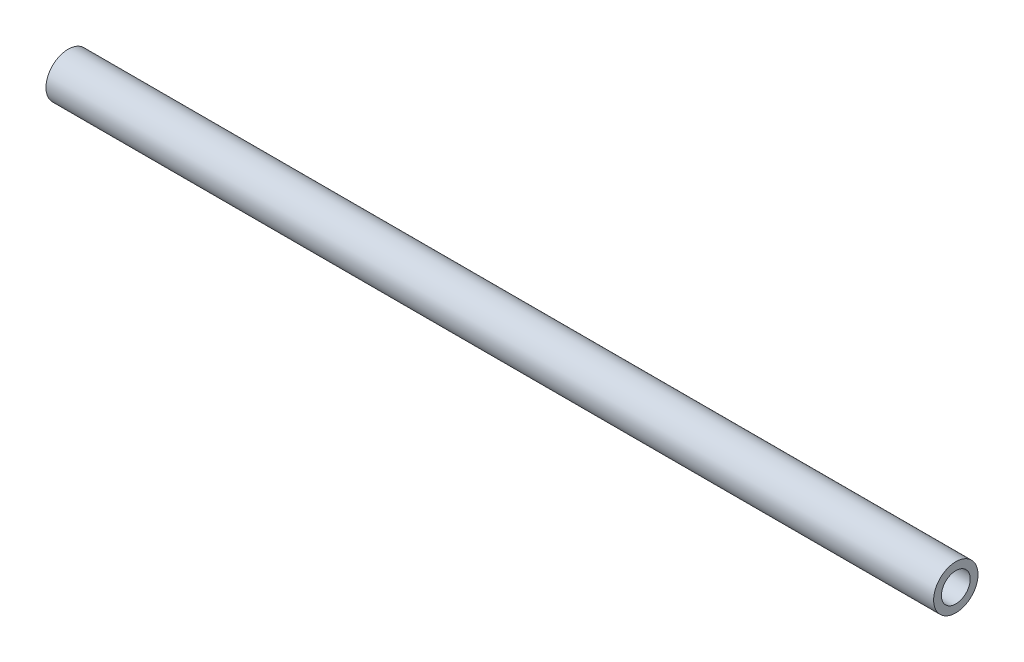
ISO-10303-21;
HEADER;
FILE_DESCRIPTION(('STEP AP214'),'2;1');
FILE_NAME('part.step','',(''),(''),'','','');
FILE_SCHEMA(('AUTOMOTIVE_DESIGN { 1 0 10303 214 1 1 1 1 }'));
ENDSEC;
DATA;
#1=APPLICATION_CONTEXT('core data for automotive mechanical design processes');
#2=APPLICATION_PROTOCOL_DEFINITION('international standard','automotive_design',2000,#1);
#3=PRODUCT_CONTEXT('',#1,'mechanical');
#4=PRODUCT('Part','Part','',(#3));
#5=PRODUCT_RELATED_PRODUCT_CATEGORY('part','',(#4));
#6=PRODUCT_DEFINITION_FORMATION('','',#4);
#7=PRODUCT_DEFINITION_CONTEXT('part definition',#1,'design');
#8=PRODUCT_DEFINITION('design','',#6,#7);
#9=PRODUCT_DEFINITION_SHAPE('','',#8);
#10=(LENGTH_UNIT() NAMED_UNIT(*) SI_UNIT(.MILLI.,.METRE.));
#11=(NAMED_UNIT(*) PLANE_ANGLE_UNIT() SI_UNIT($,.RADIAN.));
#12=(NAMED_UNIT(*) SI_UNIT($,.STERADIAN.) SOLID_ANGLE_UNIT());
#13=UNCERTAINTY_MEASURE_WITH_UNIT(LENGTH_MEASURE(1.E-05),#10,'distance_accuracy_value','');
#14=(GEOMETRIC_REPRESENTATION_CONTEXT(3) GLOBAL_UNCERTAINTY_ASSIGNED_CONTEXT((#13)) GLOBAL_UNIT_ASSIGNED_CONTEXT((#10,
#11,#12)) REPRESENTATION_CONTEXT('',''));
#15=CARTESIAN_POINT('',(0.,0.,0.));
#16=DIRECTION('',(0.,0.,1.));
#17=DIRECTION('',(1.,0.,0.));
#18=AXIS2_PLACEMENT_3D('',#15,#16,#17);
#19=CARTESIAN_POINT('',(400.,0.,0.));
#20=DIRECTION('',(1.,0.,0.));
#21=DIRECTION('',(0.,0.,-1.));
#22=AXIS2_PLACEMENT_3D('',#19,#20,#21);
#23=PLANE('',#22);
#24=CARTESIAN_POINT('',(400.,0.,0.));
#25=DIRECTION('',(1.,0.,0.));
#26=DIRECTION('',(0.,0.,-1.));
#27=AXIS2_PLACEMENT_3D('',#24,#25,#26);
#28=CIRCLE('',#27,10.);
#29=CARTESIAN_POINT('',(400.,0.,-10.));
#30=VERTEX_POINT('',#29);
#31=EDGE_CURVE('E10',#30,#30,#28,.T.);
#32=ORIENTED_EDGE('',*,*,#31,.T.);
#33=EDGE_LOOP('',(#32));
#34=FACE_BOUND('',#33,.T.);
#35=CARTESIAN_POINT('',(400.,0.,0.));
#36=DIRECTION('',(1.,0.,0.));
#37=DIRECTION('',(0.,0.,-1.));
#38=AXIS2_PLACEMENT_3D('',#35,#36,#37);
#39=CIRCLE('',#38,6.5);
#40=CARTESIAN_POINT('',(400.,0.,-6.5));
#41=VERTEX_POINT('',#40);
#42=EDGE_CURVE('E44',#41,#41,#39,.T.);
#43=ORIENTED_EDGE('',*,*,#42,.F.);
#44=EDGE_LOOP('',(#43));
#45=FACE_BOUND('',#44,.T.);
#46=ADVANCED_FACE('F33',(#34,#45),#23,.T.);
#47=CARTESIAN_POINT('',(0.,0.,0.));
#48=DIRECTION('',(1.,0.,0.));
#49=DIRECTION('',(0.,0.,-1.));
#50=AXIS2_PLACEMENT_3D('',#47,#48,#49);
#51=PLANE('',#50);
#52=CARTESIAN_POINT('',(0.,0.,0.));
#53=DIRECTION('',(1.,0.,0.));
#54=DIRECTION('',(0.,0.,-1.));
#55=AXIS2_PLACEMENT_3D('',#52,#53,#54);
#56=CIRCLE('',#55,10.);
#57=CARTESIAN_POINT('',(0.,0.,-10.));
#58=VERTEX_POINT('',#57);
#59=EDGE_CURVE('E37',#58,#58,#56,.T.);
#60=ORIENTED_EDGE('',*,*,#59,.F.);
#61=EDGE_LOOP('',(#60));
#62=FACE_BOUND('',#61,.T.);
#63=CARTESIAN_POINT('',(0.,0.,0.));
#64=DIRECTION('',(1.,0.,0.));
#65=DIRECTION('',(0.,0.,-1.));
#66=AXIS2_PLACEMENT_3D('',#63,#64,#65);
#67=CIRCLE('',#66,6.5);
#68=CARTESIAN_POINT('',(0.,0.,-6.5));
#69=VERTEX_POINT('',#68);
#70=EDGE_CURVE('E46',#69,#69,#67,.T.);
#71=ORIENTED_EDGE('',*,*,#70,.T.);
#72=EDGE_LOOP('',(#71));
#73=FACE_BOUND('',#72,.T.);
#74=ADVANCED_FACE('F56',(#62,#73),#51,.F.);
#75=CARTESIAN_POINT('',(400.,0.,0.));
#76=DIRECTION('',(-1.,0.,0.));
#77=DIRECTION('',(0.,0.,1.));
#78=AXIS2_PLACEMENT_3D('',#75,#76,#77);
#79=CYLINDRICAL_SURFACE('',#78,10.);
#80=ORIENTED_EDGE('',*,*,#31,.F.);
#81=EDGE_LOOP('',(#80));
#82=FACE_BOUND('',#81,.T.);
#83=ORIENTED_EDGE('',*,*,#59,.T.);
#84=EDGE_LOOP('',(#83));
#85=FACE_BOUND('',#84,.T.);
#86=ADVANCED_FACE('F35',(#82,#85),#79,.T.);
#87=CARTESIAN_POINT('',(400.,0.,0.));
#88=DIRECTION('',(-1.,0.,0.));
#89=DIRECTION('',(0.,0.,1.));
#90=AXIS2_PLACEMENT_3D('',#87,#88,#89);
#91=CYLINDRICAL_SURFACE('',#90,6.5);
#92=ORIENTED_EDGE('',*,*,#42,.T.);
#93=EDGE_LOOP('',(#92));
#94=FACE_BOUND('',#93,.T.);
#95=ORIENTED_EDGE('',*,*,#70,.F.);
#96=EDGE_LOOP('',(#95));
#97=FACE_BOUND('',#96,.T.);
#98=ADVANCED_FACE('F52',(#94,#97),#91,.F.);
#99=CLOSED_SHELL('',(#46,#74,#86,#98));
#100=MANIFOLD_SOLID_BREP('B2',#99);
#101=ADVANCED_BREP_SHAPE_REPRESENTATION('',(#18,#100),#14);
#102=SHAPE_DEFINITION_REPRESENTATION(#9,#101);
ENDSEC;
END-ISO-10303-21;
